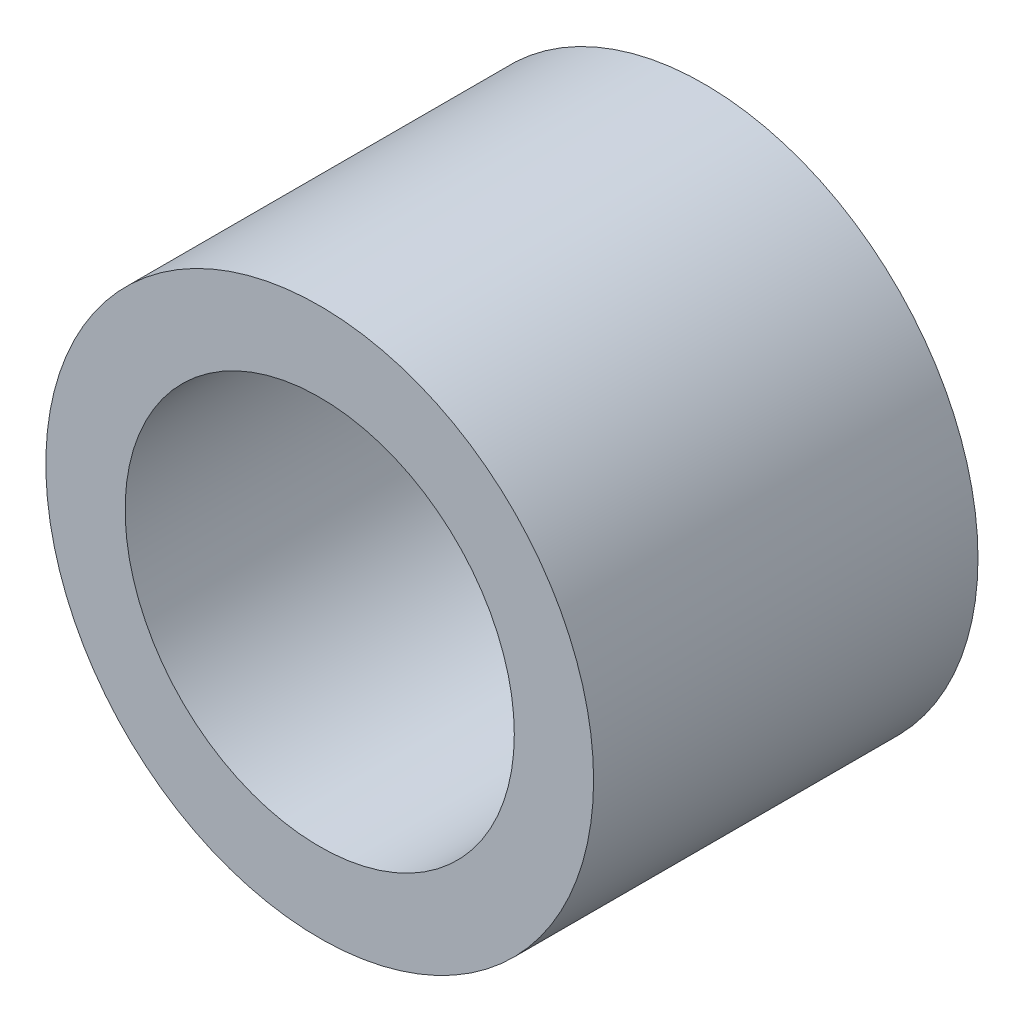
ISO-10303-21;
HEADER;
FILE_DESCRIPTION(('STEP AP214'),'2;1');
FILE_NAME('part.step','',(''),(''),'','','');
FILE_SCHEMA(('AUTOMOTIVE_DESIGN { 1 0 10303 214 1 1 1 1 }'));
ENDSEC;
DATA;
#1=APPLICATION_CONTEXT('core data for automotive mechanical design processes');
#2=APPLICATION_PROTOCOL_DEFINITION('international standard','automotive_design',2000,#1);
#3=PRODUCT_CONTEXT('',#1,'mechanical');
#4=PRODUCT('Part','Part','',(#3));
#5=PRODUCT_RELATED_PRODUCT_CATEGORY('part','',(#4));
#6=PRODUCT_DEFINITION_FORMATION('','',#4);
#7=PRODUCT_DEFINITION_CONTEXT('part definition',#1,'design');
#8=PRODUCT_DEFINITION('design','',#6,#7);
#9=PRODUCT_DEFINITION_SHAPE('','',#8);
#10=(LENGTH_UNIT() NAMED_UNIT(*) SI_UNIT(.MILLI.,.METRE.));
#11=(NAMED_UNIT(*) PLANE_ANGLE_UNIT() SI_UNIT($,.RADIAN.));
#12=(NAMED_UNIT(*) SI_UNIT($,.STERADIAN.) SOLID_ANGLE_UNIT());
#13=UNCERTAINTY_MEASURE_WITH_UNIT(LENGTH_MEASURE(1.E-05),#10,'distance_accuracy_value','');
#14=(GEOMETRIC_REPRESENTATION_CONTEXT(3) GLOBAL_UNCERTAINTY_ASSIGNED_CONTEXT((#13)) GLOBAL_UNIT_ASSIGNED_CONTEXT((#10,
#11,#12)) REPRESENTATION_CONTEXT('',''));
#15=CARTESIAN_POINT('',(0.,0.,0.));
#16=DIRECTION('',(0.,0.,1.));
#17=DIRECTION('',(1.,0.,0.));
#18=AXIS2_PLACEMENT_3D('',#15,#16,#17);
#19=CARTESIAN_POINT('',(0.,0.,4.));
#20=DIRECTION('',(0.,0.,1.));
#21=DIRECTION('',(1.,0.,0.));
#22=AXIS2_PLACEMENT_3D('',#19,#20,#21);
#23=PLANE('',#22);
#24=CARTESIAN_POINT('',(0.,0.,4.));
#25=DIRECTION('',(0.,0.,1.));
#26=DIRECTION('',(1.,0.,0.));
#27=AXIS2_PLACEMENT_3D('',#24,#25,#26);
#28=CIRCLE('',#27,2.85);
#29=CARTESIAN_POINT('',(2.85,0.,4.));
#30=VERTEX_POINT('',#29);
#31=EDGE_CURVE('E10',#30,#30,#28,.T.);
#32=ORIENTED_EDGE('',*,*,#31,.T.);
#33=EDGE_LOOP('',(#32));
#34=FACE_BOUND('',#33,.T.);
#35=CARTESIAN_POINT('',(0.,0.,4.));
#36=DIRECTION('',(0.,0.,1.));
#37=DIRECTION('',(1.,0.,0.));
#38=AXIS2_PLACEMENT_3D('',#35,#36,#37);
#39=CIRCLE('',#38,2.025);
#40=CARTESIAN_POINT('',(2.025,0.,4.));
#41=VERTEX_POINT('',#40);
#42=EDGE_CURVE('E48',#41,#41,#39,.T.);
#43=ORIENTED_EDGE('',*,*,#42,.F.);
#44=EDGE_LOOP('',(#43));
#45=FACE_BOUND('',#44,.T.);
#46=ADVANCED_FACE('F40',(#34,#45),#23,.T.);
#47=CARTESIAN_POINT('',(0.,0.,0.));
#48=DIRECTION('',(0.,0.,1.));
#49=DIRECTION('',(1.,0.,0.));
#50=AXIS2_PLACEMENT_3D('',#47,#48,#49);
#51=PLANE('',#50);
#52=CARTESIAN_POINT('',(0.,0.,0.));
#53=DIRECTION('',(0.,0.,1.));
#54=DIRECTION('',(1.,0.,0.));
#55=AXIS2_PLACEMENT_3D('',#52,#53,#54);
#56=CIRCLE('',#55,2.85);
#57=CARTESIAN_POINT('',(2.85,0.,0.));
#58=VERTEX_POINT('',#57);
#59=EDGE_CURVE('E41',#58,#58,#56,.T.);
#60=ORIENTED_EDGE('',*,*,#59,.F.);
#61=EDGE_LOOP('',(#60));
#62=FACE_BOUND('',#61,.T.);
#63=CARTESIAN_POINT('',(0.,0.,0.));
#64=DIRECTION('',(0.,0.,1.));
#65=DIRECTION('',(1.,0.,0.));
#66=AXIS2_PLACEMENT_3D('',#63,#64,#65);
#67=CIRCLE('',#66,2.025);
#68=CARTESIAN_POINT('',(2.025,0.,0.));
#69=VERTEX_POINT('',#68);
#70=EDGE_CURVE('E49',#69,#69,#67,.T.);
#71=ORIENTED_EDGE('',*,*,#70,.T.);
#72=EDGE_LOOP('',(#71));
#73=FACE_BOUND('',#72,.T.);
#74=ADVANCED_FACE('F58',(#62,#73),#51,.F.);
#75=CARTESIAN_POINT('',(0.,0.,4.));
#76=DIRECTION('',(0.,0.,-1.));
#77=DIRECTION('',(-1.,0.,0.));
#78=AXIS2_PLACEMENT_3D('',#75,#76,#77);
#79=CYLINDRICAL_SURFACE('',#78,2.85);
#80=ORIENTED_EDGE('',*,*,#31,.F.);
#81=EDGE_LOOP('',(#80));
#82=FACE_BOUND('',#81,.T.);
#83=ORIENTED_EDGE('',*,*,#59,.T.);
#84=EDGE_LOOP('',(#83));
#85=FACE_BOUND('',#84,.T.);
#86=ADVANCED_FACE('F39',(#82,#85),#79,.T.);
#87=CARTESIAN_POINT('',(0.,0.,4.));
#88=DIRECTION('',(0.,0.,-1.));
#89=DIRECTION('',(-1.,0.,0.));
#90=AXIS2_PLACEMENT_3D('',#87,#88,#89);
#91=CYLINDRICAL_SURFACE('',#90,2.025);
#92=ORIENTED_EDGE('',*,*,#42,.T.);
#93=EDGE_LOOP('',(#92));
#94=FACE_BOUND('',#93,.T.);
#95=ORIENTED_EDGE('',*,*,#70,.F.);
#96=EDGE_LOOP('',(#95));
#97=FACE_BOUND('',#96,.T.);
#98=ADVANCED_FACE('F57',(#94,#97),#91,.F.);
#99=CLOSED_SHELL('',(#46,#74,#86,#98));
#100=MANIFOLD_SOLID_BREP('B2',#99);
#101=ADVANCED_BREP_SHAPE_REPRESENTATION('',(#18,#100),#14);
#102=SHAPE_DEFINITION_REPRESENTATION(#9,#101);
ENDSEC;
END-ISO-10303-21;
